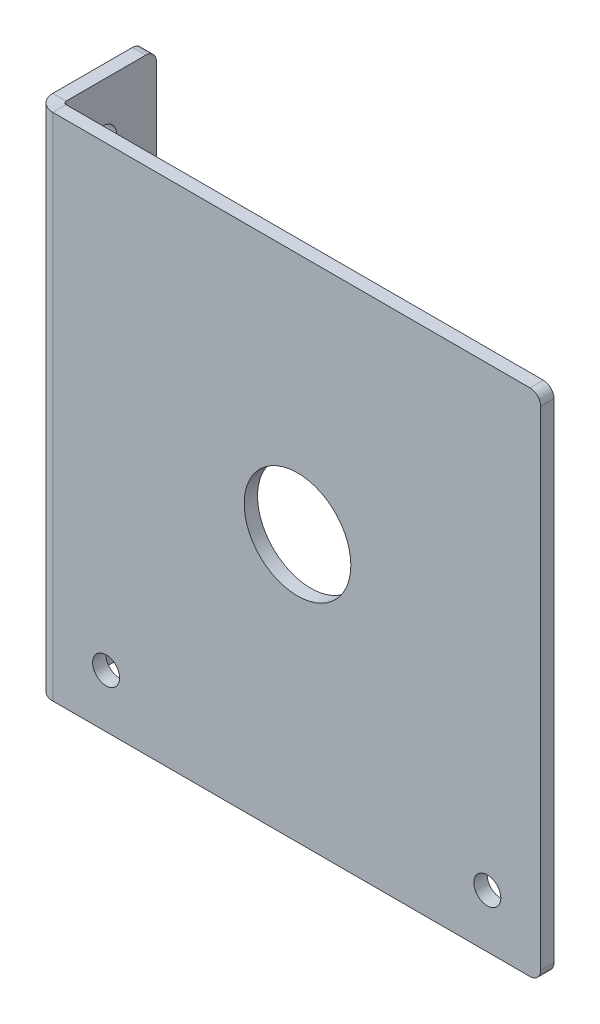
ISO-10303-21;
HEADER;
FILE_DESCRIPTION(('STEP AP214'),'2;1');
FILE_NAME('part.step','',(''),(''),'','','');
FILE_SCHEMA(('AUTOMOTIVE_DESIGN { 1 0 10303 214 1 1 1 1 }'));
ENDSEC;
DATA;
#1=APPLICATION_CONTEXT('core data for automotive mechanical design processes');
#2=APPLICATION_PROTOCOL_DEFINITION('international standard','automotive_design',2000,#1);
#3=PRODUCT_CONTEXT('',#1,'mechanical');
#4=PRODUCT('Part','Part','',(#3));
#5=PRODUCT_RELATED_PRODUCT_CATEGORY('part','',(#4));
#6=PRODUCT_DEFINITION_FORMATION('','',#4);
#7=PRODUCT_DEFINITION_CONTEXT('part definition',#1,'design');
#8=PRODUCT_DEFINITION('design','',#6,#7);
#9=PRODUCT_DEFINITION_SHAPE('','',#8);
#10=(LENGTH_UNIT() NAMED_UNIT(*) SI_UNIT(.MILLI.,.METRE.));
#11=(NAMED_UNIT(*) PLANE_ANGLE_UNIT() SI_UNIT($,.RADIAN.));
#12=(NAMED_UNIT(*) SI_UNIT($,.STERADIAN.) SOLID_ANGLE_UNIT());
#13=UNCERTAINTY_MEASURE_WITH_UNIT(LENGTH_MEASURE(1.E-05),#10,'distance_accuracy_value','');
#14=(GEOMETRIC_REPRESENTATION_CONTEXT(3) GLOBAL_UNCERTAINTY_ASSIGNED_CONTEXT((#13)) GLOBAL_UNIT_ASSIGNED_CONTEXT((#10,
#11,#12)) REPRESENTATION_CONTEXT('',''));
#15=CARTESIAN_POINT('',(0.,0.,0.));
#16=DIRECTION('',(0.,0.,1.));
#17=DIRECTION('',(1.,0.,0.));
#18=AXIS2_PLACEMENT_3D('',#15,#16,#17);
#19=CARTESIAN_POINT('',(0.,0.,3.175));
#20=DIRECTION('',(0.,0.,1.));
#21=DIRECTION('',(1.,0.,0.));
#22=AXIS2_PLACEMENT_3D('',#19,#20,#21);
#23=PLANE('',#22);
#24=CARTESIAN_POINT('',(-45.576335057773,-50.8,3.175));
#25=DIRECTION('',(0.,0.,-1.));
#26=DIRECTION('',(-1.,0.,0.));
#27=AXIS2_PLACEMENT_3D('',#24,#25,#26);
#28=CIRCLE('',#27,3.20625370577771);
#29=CARTESIAN_POINT('',(-48.7825887635507,-50.8,3.175));
#30=VERTEX_POINT('',#29);
#31=EDGE_CURVE('E315',#30,#30,#28,.T.);
#32=ORIENTED_EDGE('',*,*,#31,.T.);
#33=EDGE_LOOP('',(#32));
#34=FACE_BOUND('',#33,.T.);
#35=CARTESIAN_POINT('',(45.2,-50.8,3.175));
#36=DIRECTION('',(0.,0.,-1.));
#37=DIRECTION('',(-1.,0.,0.));
#38=AXIS2_PLACEMENT_3D('',#35,#36,#37);
#39=CIRCLE('',#38,3.20625370577771);
#40=CARTESIAN_POINT('',(41.9937462942223,-50.8,3.175));
#41=VERTEX_POINT('',#40);
#42=EDGE_CURVE('E323',#41,#41,#39,.T.);
#43=ORIENTED_EDGE('',*,*,#42,.T.);
#44=EDGE_LOOP('',(#43));
#45=FACE_BOUND('',#44,.T.);
#46=CARTESIAN_POINT('',(0.,0.,3.175));
#47=DIRECTION('',(0.,0.,1.));
#48=DIRECTION('',(1.,0.,0.));
#49=AXIS2_PLACEMENT_3D('',#46,#47,#48);
#50=CIRCLE('',#49,12.7);
#51=CARTESIAN_POINT('',(12.7,0.,3.175));
#52=VERTEX_POINT('',#51);
#53=EDGE_CURVE('E226',#52,#52,#50,.T.);
#54=ORIENTED_EDGE('',*,*,#53,.F.);
#55=EDGE_LOOP('',(#54));
#56=FACE_BOUND('',#55,.T.);
#57=DIRECTION('',(1.,0.,0.));
#58=VECTOR('',#57,1.);
#59=CARTESIAN_POINT('',(-62.187935057773,-63.5,3.175));
#60=LINE('',#59,#58);
#61=CARTESIAN_POINT('',(-58.276335057773,-63.5,3.175));
#62=VERTEX_POINT('',#61);
#63=CARTESIAN_POINT('',(55.36,-63.5,3.175));
#64=VERTEX_POINT('',#63);
#65=EDGE_CURVE('E234',#62,#64,#60,.T.);
#66=ORIENTED_EDGE('',*,*,#65,.T.);
#67=CARTESIAN_POINT('',(55.36,-60.96,3.175));
#68=DIRECTION('',(0.,0.,1.));
#69=DIRECTION('',(1.,0.,0.));
#70=AXIS2_PLACEMENT_3D('',#67,#68,#69);
#71=CIRCLE('',#70,2.54);
#72=CARTESIAN_POINT('',(57.9,-60.96,3.175));
#73=VERTEX_POINT('',#72);
#74=EDGE_CURVE('E73',#64,#73,#71,.T.);
#75=ORIENTED_EDGE('',*,*,#74,.T.);
#76=DIRECTION('',(0.,1.,0.));
#77=VECTOR('',#76,1.);
#78=CARTESIAN_POINT('',(57.9,-63.5,3.175));
#79=LINE('',#78,#77);
#80=CARTESIAN_POINT('',(57.9,55.36,3.175));
#81=VERTEX_POINT('',#80);
#82=EDGE_CURVE('E237',#73,#81,#79,.T.);
#83=ORIENTED_EDGE('',*,*,#82,.T.);
#84=CARTESIAN_POINT('',(55.36,55.36,3.175));
#85=DIRECTION('',(0.,0.,1.));
#86=DIRECTION('',(1.,0.,0.));
#87=AXIS2_PLACEMENT_3D('',#84,#85,#86);
#88=CIRCLE('',#87,2.54);
#89=CARTESIAN_POINT('',(55.36,57.9,3.175));
#90=VERTEX_POINT('',#89);
#91=EDGE_CURVE('E80',#81,#90,#88,.T.);
#92=ORIENTED_EDGE('',*,*,#91,.T.);
#93=DIRECTION('',(-1.,0.,0.));
#94=VECTOR('',#93,1.);
#95=CARTESIAN_POINT('',(-62.187935057773,57.9,3.175));
#96=LINE('',#95,#94);
#97=CARTESIAN_POINT('',(-58.276335057773,57.9,3.175));
#98=VERTEX_POINT('',#97);
#99=EDGE_CURVE('E232',#90,#98,#96,.T.);
#100=ORIENTED_EDGE('',*,*,#99,.T.);
#101=DIRECTION('',(0.,1.,0.));
#102=VECTOR('',#101,1.);
#103=CARTESIAN_POINT('',(-58.276335057773,57.9,3.175));
#104=LINE('',#103,#102);
#105=EDGE_CURVE('E165',#98,#62,#104,.F.);
#106=ORIENTED_EDGE('',*,*,#105,.T.);
#107=EDGE_LOOP('',(#66,#75,#83,#92,#100,#106));
#108=FACE_BOUND('',#107,.T.);
#109=ADVANCED_FACE('F65',(#34,#45,#56,#108),#23,.T.);
#110=CARTESIAN_POINT('',(0.,0.,0.));
#111=DIRECTION('',(0.,0.,1.));
#112=DIRECTION('',(1.,0.,0.));
#113=AXIS2_PLACEMENT_3D('',#110,#111,#112);
#114=PLANE('',#113);
#115=CARTESIAN_POINT('',(-45.576335057773,-50.8,0.));
#116=DIRECTION('',(0.,0.,-1.));
#117=DIRECTION('',(-1.,0.,0.));
#118=AXIS2_PLACEMENT_3D('',#115,#116,#117);
#119=CIRCLE('',#118,3.20625370577771);
#120=CARTESIAN_POINT('',(-48.7825887635507,-50.8,0.));
#121=VERTEX_POINT('',#120);
#122=EDGE_CURVE('E329',#121,#121,#119,.T.);
#123=ORIENTED_EDGE('',*,*,#122,.F.);
#124=EDGE_LOOP('',(#123));
#125=FACE_BOUND('',#124,.T.);
#126=CARTESIAN_POINT('',(45.2,-50.8,0.));
#127=DIRECTION('',(0.,0.,-1.));
#128=DIRECTION('',(-1.,0.,0.));
#129=AXIS2_PLACEMENT_3D('',#126,#127,#128);
#130=CIRCLE('',#129,3.20625370577771);
#131=CARTESIAN_POINT('',(41.9937462942223,-50.8,0.));
#132=VERTEX_POINT('',#131);
#133=EDGE_CURVE('E326',#132,#132,#130,.T.);
#134=ORIENTED_EDGE('',*,*,#133,.F.);
#135=EDGE_LOOP('',(#134));
#136=FACE_BOUND('',#135,.T.);
#137=CARTESIAN_POINT('',(0.,0.,0.));
#138=DIRECTION('',(0.,0.,1.));
#139=DIRECTION('',(1.,0.,0.));
#140=AXIS2_PLACEMENT_3D('',#137,#138,#139);
#141=CIRCLE('',#140,12.7);
#142=CARTESIAN_POINT('',(12.7,0.,0.));
#143=VERTEX_POINT('',#142);
#144=EDGE_CURVE('E224',#143,#143,#141,.T.);
#145=ORIENTED_EDGE('',*,*,#144,.T.);
#146=EDGE_LOOP('',(#145));
#147=FACE_BOUND('',#146,.T.);
#148=DIRECTION('',(0.,1.,0.));
#149=VECTOR('',#148,1.);
#150=CARTESIAN_POINT('',(57.9,-63.5,0.));
#151=LINE('',#150,#149);
#152=CARTESIAN_POINT('',(57.9,-60.96,0.));
#153=VERTEX_POINT('',#152);
#154=CARTESIAN_POINT('',(57.9,55.36,0.));
#155=VERTEX_POINT('',#154);
#156=EDGE_CURVE('E235',#153,#155,#151,.T.);
#157=ORIENTED_EDGE('',*,*,#156,.F.);
#158=CARTESIAN_POINT('',(55.36,-60.96,0.));
#159=DIRECTION('',(0.,0.,1.));
#160=DIRECTION('',(1.,0.,0.));
#161=AXIS2_PLACEMENT_3D('',#158,#159,#160);
#162=CIRCLE('',#161,2.54);
#163=CARTESIAN_POINT('',(55.36,-63.5,0.));
#164=VERTEX_POINT('',#163);
#165=EDGE_CURVE('E268',#153,#164,#162,.F.);
#166=ORIENTED_EDGE('',*,*,#165,.T.);
#167=DIRECTION('',(1.,0.,0.));
#168=VECTOR('',#167,1.);
#169=CARTESIAN_POINT('',(-62.187935057773,-63.5,0.));
#170=LINE('',#169,#168);
#171=CARTESIAN_POINT('',(-58.276335057773,-63.5,0.));
#172=VERTEX_POINT('',#171);
#173=EDGE_CURVE('E241',#172,#164,#170,.T.);
#174=ORIENTED_EDGE('',*,*,#173,.F.);
#175=DIRECTION('',(0.,1.,0.));
#176=VECTOR('',#175,1.);
#177=CARTESIAN_POINT('',(-58.276335057773,57.9,0.));
#178=LINE('',#177,#176);
#179=CARTESIAN_POINT('',(-58.276335057773,57.9,0.));
#180=VERTEX_POINT('',#179);
#181=EDGE_CURVE('E218',#180,#172,#178,.F.);
#182=ORIENTED_EDGE('',*,*,#181,.F.);
#183=DIRECTION('',(-1.,0.,0.));
#184=VECTOR('',#183,1.);
#185=CARTESIAN_POINT('',(-62.187935057773,57.9,0.));
#186=LINE('',#185,#184);
#187=CARTESIAN_POINT('',(55.36,57.9,0.));
#188=VERTEX_POINT('',#187);
#189=EDGE_CURVE('E229',#188,#180,#186,.T.);
#190=ORIENTED_EDGE('',*,*,#189,.F.);
#191=CARTESIAN_POINT('',(55.36,55.36,0.));
#192=DIRECTION('',(0.,0.,1.));
#193=DIRECTION('',(1.,0.,0.));
#194=AXIS2_PLACEMENT_3D('',#191,#192,#193);
#195=CIRCLE('',#194,2.54);
#196=EDGE_CURVE('E266',#188,#155,#195,.F.);
#197=ORIENTED_EDGE('',*,*,#196,.T.);
#198=EDGE_LOOP('',(#157,#166,#174,#182,#190,#197));
#199=FACE_BOUND('',#198,.T.);
#200=ADVANCED_FACE('F282',(#125,#136,#147,#199),#114,.F.);
#201=CARTESIAN_POINT('',(-62.187935057773,57.9,3.175));
#202=DIRECTION('',(0.,-1.,0.));
#203=DIRECTION('',(1.,0.,0.));
#204=AXIS2_PLACEMENT_3D('',#201,#202,#203);
#205=PLANE('',#204);
#206=ORIENTED_EDGE('',*,*,#99,.F.);
#207=DIRECTION('',(0.,0.,-1.));
#208=VECTOR('',#207,1.);
#209=CARTESIAN_POINT('',(55.36,57.9,3.175));
#210=LINE('',#209,#208);
#211=EDGE_CURVE('E13',#90,#188,#210,.T.);
#212=ORIENTED_EDGE('',*,*,#211,.T.);
#213=ORIENTED_EDGE('',*,*,#189,.T.);
#214=DIRECTION('',(0.,0.,1.));
#215=VECTOR('',#214,1.);
#216=CARTESIAN_POINT('',(-58.276335057773,57.9,0.));
#217=LINE('',#216,#215);
#218=EDGE_CURVE('E214',#180,#98,#217,.T.);
#219=ORIENTED_EDGE('',*,*,#218,.T.);
#220=EDGE_LOOP('',(#206,#212,#213,#219));
#221=FACE_BOUND('',#220,.T.);
#222=ADVANCED_FACE('F346',(#221),#205,.F.);
#223=CARTESIAN_POINT('',(-62.187935057773,-63.5,3.175));
#224=DIRECTION('',(0.,1.,0.));
#225=DIRECTION('',(0.,0.,1.));
#226=AXIS2_PLACEMENT_3D('',#223,#224,#225);
#227=PLANE('',#226);
#228=ORIENTED_EDGE('',*,*,#173,.T.);
#229=DIRECTION('',(0.,0.,-1.));
#230=VECTOR('',#229,1.);
#231=CARTESIAN_POINT('',(55.36,-63.5,3.175));
#232=LINE('',#231,#230);
#233=EDGE_CURVE('E88',#164,#64,#232,.F.);
#234=ORIENTED_EDGE('',*,*,#233,.T.);
#235=ORIENTED_EDGE('',*,*,#65,.F.);
#236=DIRECTION('',(0.,0.,1.));
#237=VECTOR('',#236,1.);
#238=CARTESIAN_POINT('',(-58.276335057773,-63.5,0.));
#239=LINE('',#238,#237);
#240=EDGE_CURVE('E221',#172,#62,#239,.T.);
#241=ORIENTED_EDGE('',*,*,#240,.F.);
#242=EDGE_LOOP('',(#228,#234,#235,#241));
#243=FACE_BOUND('',#242,.T.);
#244=ADVANCED_FACE('F285',(#243),#227,.F.);
#245=CARTESIAN_POINT('',(57.9,-63.5,3.175));
#246=DIRECTION('',(-1.,0.,0.));
#247=DIRECTION('',(0.,-1.,0.));
#248=AXIS2_PLACEMENT_3D('',#245,#246,#247);
#249=PLANE('',#248);
#250=ORIENTED_EDGE('',*,*,#82,.F.);
#251=DIRECTION('',(0.,0.,-1.));
#252=VECTOR('',#251,1.);
#253=CARTESIAN_POINT('',(57.9,-60.96,3.175));
#254=LINE('',#253,#252);
#255=EDGE_CURVE('E263',#73,#153,#254,.T.);
#256=ORIENTED_EDGE('',*,*,#255,.T.);
#257=ORIENTED_EDGE('',*,*,#156,.T.);
#258=DIRECTION('',(0.,0.,-1.));
#259=VECTOR('',#258,1.);
#260=CARTESIAN_POINT('',(57.9,55.36,3.175));
#261=LINE('',#260,#259);
#262=EDGE_CURVE('E261',#155,#81,#261,.F.);
#263=ORIENTED_EDGE('',*,*,#262,.T.);
#264=EDGE_LOOP('',(#250,#256,#257,#263));
#265=FACE_BOUND('',#264,.T.);
#266=ADVANCED_FACE('F276',(#265),#249,.F.);
#267=CARTESIAN_POINT('',(0.,0.,3.175));
#268=DIRECTION('',(0.,0.,-1.));
#269=DIRECTION('',(-1.,0.,0.));
#270=AXIS2_PLACEMENT_3D('',#267,#268,#269);
#271=CYLINDRICAL_SURFACE('',#270,12.7);
#272=ORIENTED_EDGE('',*,*,#53,.T.);
#273=EDGE_LOOP('',(#272));
#274=FACE_BOUND('',#273,.T.);
#275=ORIENTED_EDGE('',*,*,#144,.F.);
#276=EDGE_LOOP('',(#275));
#277=FACE_BOUND('',#276,.T.);
#278=ADVANCED_FACE('F352',(#274,#277),#271,.F.);
#279=CARTESIAN_POINT('',(-58.276335057773,-63.5,-0.736599999999999));
#280=DIRECTION('',(0.,-1.,0.));
#281=DIRECTION('',(0.,0.,-1.));
#282=AXIS2_PLACEMENT_3D('',#279,#280,#281);
#283=PLANE('',#282);
#284=DIRECTION('',(1.,0.,0.));
#285=VECTOR('',#284,1.);
#286=CARTESIAN_POINT('',(-62.187935057773,-63.5,-0.736599999999986));
#287=LINE('',#286,#285);
#288=CARTESIAN_POINT('',(-59.012935057773,-63.5,-0.736599999999997));
#289=VERTEX_POINT('',#288);
#290=CARTESIAN_POINT('',(-62.187935057773,-63.5,-0.736599999999986));
#291=VERTEX_POINT('',#290);
#292=EDGE_CURVE('E208',#289,#291,#287,.F.);
#293=ORIENTED_EDGE('',*,*,#292,.F.);
#294=CARTESIAN_POINT('',(-58.276335057773,-63.5,-0.736599999999999));
#295=DIRECTION('',(0.,1.,0.));
#296=DIRECTION('',(0.,0.,1.));
#297=AXIS2_PLACEMENT_3D('',#294,#295,#296);
#298=CIRCLE('',#297,0.736600000000004);
#299=EDGE_CURVE('E169',#172,#289,#298,.F.);
#300=ORIENTED_EDGE('',*,*,#299,.F.);
#301=ORIENTED_EDGE('',*,*,#240,.T.);
#302=CARTESIAN_POINT('',(-58.276335057773,-63.5,-0.736599999999999));
#303=DIRECTION('',(0.,1.,0.));
#304=DIRECTION('',(0.,0.,1.));
#305=AXIS2_PLACEMENT_3D('',#302,#303,#304);
#306=CIRCLE('',#305,3.9116);
#307=EDGE_CURVE('E213',#62,#291,#306,.F.);
#308=ORIENTED_EDGE('',*,*,#307,.T.);
#309=EDGE_LOOP('',(#293,#300,#301,#308));
#310=FACE_BOUND('',#309,.T.);
#311=ADVANCED_FACE('F289',(#310),#283,.T.);
#312=CARTESIAN_POINT('',(-58.276335057773,57.9,-0.736599999999999));
#313=DIRECTION('',(0.,-1.,0.));
#314=DIRECTION('',(0.,0.,-1.));
#315=AXIS2_PLACEMENT_3D('',#312,#313,#314);
#316=PLANE('',#315);
#317=CARTESIAN_POINT('',(-58.276335057773,57.9,-0.736599999999999));
#318=DIRECTION('',(0.,1.,0.));
#319=DIRECTION('',(0.,0.,1.));
#320=AXIS2_PLACEMENT_3D('',#317,#318,#319);
#321=CIRCLE('',#320,0.736600000000004);
#322=CARTESIAN_POINT('',(-59.012935057773,57.9,-0.736599999999997));
#323=VERTEX_POINT('',#322);
#324=EDGE_CURVE('E176',#323,#180,#321,.T.);
#325=ORIENTED_EDGE('',*,*,#324,.F.);
#326=DIRECTION('',(1.,0.,0.));
#327=VECTOR('',#326,1.);
#328=CARTESIAN_POINT('',(-59.012935057773,57.9,-0.736599999999997));
#329=LINE('',#328,#327);
#330=CARTESIAN_POINT('',(-62.187935057773,57.9,-0.736599999999986));
#331=VERTEX_POINT('',#330);
#332=EDGE_CURVE('E173',#323,#331,#329,.F.);
#333=ORIENTED_EDGE('',*,*,#332,.T.);
#334=CARTESIAN_POINT('',(-58.276335057773,57.9,-0.736599999999999));
#335=DIRECTION('',(0.,1.,0.));
#336=DIRECTION('',(0.,0.,1.));
#337=AXIS2_PLACEMENT_3D('',#334,#335,#336);
#338=CIRCLE('',#337,3.9116);
#339=EDGE_CURVE('E158',#331,#98,#338,.T.);
#340=ORIENTED_EDGE('',*,*,#339,.T.);
#341=ORIENTED_EDGE('',*,*,#218,.F.);
#342=EDGE_LOOP('',(#325,#333,#340,#341));
#343=FACE_BOUND('',#342,.T.);
#344=ADVANCED_FACE('F174',(#343),#316,.F.);
#345=CARTESIAN_POINT('',(-58.276335057773,57.9,-0.736599999999999));
#346=DIRECTION('',(0.,1.,0.));
#347=DIRECTION('',(-1.,0.,0.));
#348=AXIS2_PLACEMENT_3D('',#345,#346,#347);
#349=CYLINDRICAL_SURFACE('',#348,3.9116);
#350=ORIENTED_EDGE('',*,*,#105,.F.);
#351=ORIENTED_EDGE('',*,*,#339,.F.);
#352=DIRECTION('',(0.,1.,0.));
#353=VECTOR('',#352,1.);
#354=CARTESIAN_POINT('',(-62.187935057773,-63.5,-0.736599999999986));
#355=LINE('',#354,#353);
#356=EDGE_CURVE('E162',#331,#291,#355,.F.);
#357=ORIENTED_EDGE('',*,*,#356,.T.);
#358=ORIENTED_EDGE('',*,*,#307,.F.);
#359=EDGE_LOOP('',(#350,#351,#357,#358));
#360=FACE_BOUND('',#359,.T.);
#361=ADVANCED_FACE('F160',(#360),#349,.T.);
#362=CARTESIAN_POINT('',(-58.276335057773,57.9,-0.736599999999999));
#363=DIRECTION('',(0.,1.,0.));
#364=DIRECTION('',(-1.,0.,0.));
#365=AXIS2_PLACEMENT_3D('',#362,#363,#364);
#366=CYLINDRICAL_SURFACE('',#365,0.736600000000004);
#367=ORIENTED_EDGE('',*,*,#181,.T.);
#368=ORIENTED_EDGE('',*,*,#299,.T.);
#369=DIRECTION('',(0.,1.,0.));
#370=VECTOR('',#369,1.);
#371=CARTESIAN_POINT('',(-59.012935057773,-63.5,-0.736599999999997));
#372=LINE('',#371,#370);
#373=EDGE_CURVE('E181',#289,#323,#372,.T.);
#374=ORIENTED_EDGE('',*,*,#373,.T.);
#375=ORIENTED_EDGE('',*,*,#324,.T.);
#376=EDGE_LOOP('',(#367,#368,#374,#375));
#377=FACE_BOUND('',#376,.T.);
#378=ADVANCED_FACE('F292',(#377),#366,.F.);
#379=CARTESIAN_POINT('',(-62.1879350577731,57.9,-22.225));
#380=DIRECTION('',(0.,-1.,0.));
#381=DIRECTION('',(0.,0.,-1.));
#382=AXIS2_PLACEMENT_3D('',#379,#380,#381);
#383=PLANE('',#382);
#384=DIRECTION('',(0.,0.,1.));
#385=VECTOR('',#384,1.);
#386=CARTESIAN_POINT('',(-59.012935057773,57.9,-22.225));
#387=LINE('',#386,#385);
#388=CARTESIAN_POINT('',(-59.012935057773,57.9,-19.685));
#389=VERTEX_POINT('',#388);
#390=EDGE_CURVE('E191',#323,#389,#387,.F.);
#391=ORIENTED_EDGE('',*,*,#390,.T.);
#392=DIRECTION('',(1.,0.,0.));
#393=VECTOR('',#392,1.);
#394=CARTESIAN_POINT('',(-62.187935057773,57.9,-19.685));
#395=LINE('',#394,#393);
#396=CARTESIAN_POINT('',(-62.187935057773,57.9,-19.685));
#397=VERTEX_POINT('',#396);
#398=EDGE_CURVE('E195',#389,#397,#395,.F.);
#399=ORIENTED_EDGE('',*,*,#398,.T.);
#400=DIRECTION('',(0.,0.,-1.));
#401=VECTOR('',#400,1.);
#402=CARTESIAN_POINT('',(-62.187935057773,57.9,1.3427377869413E-13));
#403=LINE('',#402,#401);
#404=EDGE_CURVE('E187',#331,#397,#403,.T.);
#405=ORIENTED_EDGE('',*,*,#404,.F.);
#406=ORIENTED_EDGE('',*,*,#332,.F.);
#407=EDGE_LOOP('',(#391,#399,#405,#406));
#408=FACE_BOUND('',#407,.T.);
#409=ADVANCED_FACE('F193',(#408),#383,.F.);
#410=CARTESIAN_POINT('',(-62.187935057773,-63.5,0.));
#411=DIRECTION('',(0.,1.,0.));
#412=DIRECTION('',(0.,0.,1.));
#413=AXIS2_PLACEMENT_3D('',#410,#411,#412);
#414=PLANE('',#413);
#415=DIRECTION('',(0.,0.,1.));
#416=VECTOR('',#415,1.);
#417=CARTESIAN_POINT('',(-62.187935057773,-63.5,2.24658920884508E-13));
#418=LINE('',#417,#416);
#419=CARTESIAN_POINT('',(-62.187935057773,-63.5,-19.685));
#420=VERTEX_POINT('',#419);
#421=EDGE_CURVE('E190',#420,#291,#418,.T.);
#422=ORIENTED_EDGE('',*,*,#421,.F.);
#423=DIRECTION('',(1.,0.,0.));
#424=VECTOR('',#423,1.);
#425=CARTESIAN_POINT('',(-62.187935057773,-63.5,-19.685));
#426=LINE('',#425,#424);
#427=CARTESIAN_POINT('',(-59.012935057773,-63.5,-19.685));
#428=VERTEX_POINT('',#427);
#429=EDGE_CURVE('E239',#420,#428,#426,.T.);
#430=ORIENTED_EDGE('',*,*,#429,.T.);
#431=DIRECTION('',(0.,0.,-1.));
#432=VECTOR('',#431,1.);
#433=CARTESIAN_POINT('',(-59.012935057773,-63.5,0.));
#434=LINE('',#433,#432);
#435=EDGE_CURVE('E197',#428,#289,#434,.F.);
#436=ORIENTED_EDGE('',*,*,#435,.T.);
#437=ORIENTED_EDGE('',*,*,#292,.T.);
#438=EDGE_LOOP('',(#422,#430,#436,#437));
#439=FACE_BOUND('',#438,.T.);
#440=ADVANCED_FACE('F309',(#439),#414,.F.);
#441=CARTESIAN_POINT('',(-62.187935057773,0.,2.24658920884508E-13));
#442=DIRECTION('',(1.,0.,0.));
#443=DIRECTION('',(0.,0.,-1.));
#444=AXIS2_PLACEMENT_3D('',#441,#442,#443);
#445=PLANE('',#444);
#446=CARTESIAN_POINT('',(-62.1879350577731,45.2,-9.525));
#447=DIRECTION('',(1.,0.,0.));
#448=DIRECTION('',(0.,0.,-1.));
#449=AXIS2_PLACEMENT_3D('',#446,#447,#448);
#450=CIRCLE('',#449,3.205);
#451=CARTESIAN_POINT('',(-62.1879350577731,45.2,-12.73));
#452=VERTEX_POINT('',#451);
#453=EDGE_CURVE('E211',#452,#452,#450,.T.);
#454=ORIENTED_EDGE('',*,*,#453,.T.);
#455=EDGE_LOOP('',(#454));
#456=FACE_BOUND('',#455,.T.);
#457=CARTESIAN_POINT('',(-62.1879350577731,-25.4,-9.525));
#458=DIRECTION('',(1.,0.,0.));
#459=DIRECTION('',(0.,0.,-1.));
#460=AXIS2_PLACEMENT_3D('',#457,#458,#459);
#461=CIRCLE('',#460,3.205);
#462=CARTESIAN_POINT('',(-62.1879350577731,-25.4,-12.73));
#463=VERTEX_POINT('',#462);
#464=EDGE_CURVE('E311',#463,#463,#461,.T.);
#465=ORIENTED_EDGE('',*,*,#464,.T.);
#466=EDGE_LOOP('',(#465));
#467=FACE_BOUND('',#466,.T.);
#468=DIRECTION('',(0.,-1.,0.));
#469=VECTOR('',#468,1.);
#470=CARTESIAN_POINT('',(-62.187935057773,0.,-22.225));
#471=LINE('',#470,#469);
#472=CARTESIAN_POINT('',(-62.187935057773,55.36,-22.225));
#473=VERTEX_POINT('',#472);
#474=CARTESIAN_POINT('',(-62.187935057773,-60.96,-22.225));
#475=VERTEX_POINT('',#474);
#476=EDGE_CURVE('E196',#473,#475,#471,.T.);
#477=ORIENTED_EDGE('',*,*,#476,.T.);
#478=CARTESIAN_POINT('',(-62.187935057773,-60.96,-19.685));
#479=DIRECTION('',(1.,0.,0.));
#480=DIRECTION('',(0.,0.,-1.));
#481=AXIS2_PLACEMENT_3D('',#478,#479,#480);
#482=CIRCLE('',#481,2.54);
#483=EDGE_CURVE('E258',#475,#420,#482,.F.);
#484=ORIENTED_EDGE('',*,*,#483,.T.);
#485=ORIENTED_EDGE('',*,*,#421,.T.);
#486=ORIENTED_EDGE('',*,*,#356,.F.);
#487=ORIENTED_EDGE('',*,*,#404,.T.);
#488=CARTESIAN_POINT('',(-62.187935057773,55.36,-19.685));
#489=DIRECTION('',(1.,0.,0.));
#490=DIRECTION('',(0.,0.,-1.));
#491=AXIS2_PLACEMENT_3D('',#488,#489,#490);
#492=CIRCLE('',#491,2.54);
#493=EDGE_CURVE('E256',#397,#473,#492,.F.);
#494=ORIENTED_EDGE('',*,*,#493,.T.);
#495=EDGE_LOOP('',(#477,#484,#485,#486,#487,#494));
#496=FACE_BOUND('',#495,.T.);
#497=ADVANCED_FACE('F186',(#456,#467,#496),#445,.F.);
#498=CARTESIAN_POINT('',(-59.012935057773,0.,2.13573467633681E-13));
#499=DIRECTION('',(1.,0.,0.));
#500=DIRECTION('',(0.,0.,-1.));
#501=AXIS2_PLACEMENT_3D('',#498,#499,#500);
#502=PLANE('',#501);
#503=CARTESIAN_POINT('',(-59.012935057773,45.2,-9.52500000000001));
#504=DIRECTION('',(1.,0.,0.));
#505=DIRECTION('',(0.,0.,-1.));
#506=AXIS2_PLACEMENT_3D('',#503,#504,#505);
#507=CIRCLE('',#506,3.205);
#508=CARTESIAN_POINT('',(-59.012935057773,45.2,-12.73));
#509=VERTEX_POINT('',#508);
#510=EDGE_CURVE('E318',#509,#509,#507,.T.);
#511=ORIENTED_EDGE('',*,*,#510,.F.);
#512=EDGE_LOOP('',(#511));
#513=FACE_BOUND('',#512,.T.);
#514=CARTESIAN_POINT('',(-59.012935057773,-25.4,-9.52500000000001));
#515=DIRECTION('',(1.,0.,0.));
#516=DIRECTION('',(0.,0.,-1.));
#517=AXIS2_PLACEMENT_3D('',#514,#515,#516);
#518=CIRCLE('',#517,3.205);
#519=CARTESIAN_POINT('',(-59.012935057773,-25.4,-12.73));
#520=VERTEX_POINT('',#519);
#521=EDGE_CURVE('E314',#520,#520,#518,.T.);
#522=ORIENTED_EDGE('',*,*,#521,.F.);
#523=EDGE_LOOP('',(#522));
#524=FACE_BOUND('',#523,.T.);
#525=ORIENTED_EDGE('',*,*,#435,.F.);
#526=CARTESIAN_POINT('',(-59.012935057773,-60.96,-19.685));
#527=DIRECTION('',(1.,0.,0.));
#528=DIRECTION('',(0.,0.,-1.));
#529=AXIS2_PLACEMENT_3D('',#526,#527,#528);
#530=CIRCLE('',#529,2.54);
#531=CARTESIAN_POINT('',(-59.012935057773,-60.96,-22.225));
#532=VERTEX_POINT('',#531);
#533=EDGE_CURVE('E249',#428,#532,#530,.T.);
#534=ORIENTED_EDGE('',*,*,#533,.T.);
#535=DIRECTION('',(0.,1.,0.));
#536=VECTOR('',#535,1.);
#537=CARTESIAN_POINT('',(-59.012935057773,-63.5,-22.225));
#538=LINE('',#537,#536);
#539=CARTESIAN_POINT('',(-59.012935057773,55.36,-22.225));
#540=VERTEX_POINT('',#539);
#541=EDGE_CURVE('E200',#540,#532,#538,.F.);
#542=ORIENTED_EDGE('',*,*,#541,.F.);
#543=CARTESIAN_POINT('',(-59.012935057773,55.36,-19.685));
#544=DIRECTION('',(1.,0.,0.));
#545=DIRECTION('',(0.,0.,-1.));
#546=AXIS2_PLACEMENT_3D('',#543,#544,#545);
#547=CIRCLE('',#546,2.54);
#548=EDGE_CURVE('E247',#540,#389,#547,.T.);
#549=ORIENTED_EDGE('',*,*,#548,.T.);
#550=ORIENTED_EDGE('',*,*,#390,.F.);
#551=ORIENTED_EDGE('',*,*,#373,.F.);
#552=EDGE_LOOP('',(#525,#534,#542,#549,#550,#551));
#553=FACE_BOUND('',#552,.T.);
#554=ADVANCED_FACE('F295',(#513,#524,#553),#502,.T.);
#555=CARTESIAN_POINT('',(-62.1879350577731,-63.5,-22.225));
#556=DIRECTION('',(0.,0.,1.));
#557=DIRECTION('',(1.,0.,0.));
#558=AXIS2_PLACEMENT_3D('',#555,#556,#557);
#559=PLANE('',#558);
#560=ORIENTED_EDGE('',*,*,#541,.T.);
#561=DIRECTION('',(1.,0.,0.));
#562=VECTOR('',#561,1.);
#563=CARTESIAN_POINT('',(-62.1879350577731,-60.96,-22.225));
#564=LINE('',#563,#562);
#565=EDGE_CURVE('E254',#532,#475,#564,.F.);
#566=ORIENTED_EDGE('',*,*,#565,.T.);
#567=ORIENTED_EDGE('',*,*,#476,.F.);
#568=DIRECTION('',(1.,0.,0.));
#569=VECTOR('',#568,1.);
#570=CARTESIAN_POINT('',(-62.1879350577731,55.36,-22.225));
#571=LINE('',#570,#569);
#572=EDGE_CURVE('E251',#473,#540,#571,.T.);
#573=ORIENTED_EDGE('',*,*,#572,.T.);
#574=EDGE_LOOP('',(#560,#566,#567,#573));
#575=FACE_BOUND('',#574,.T.);
#576=ADVANCED_FACE('F303',(#575),#559,.F.);
#577=CARTESIAN_POINT('',(-62.187935057773,-60.96,-19.685));
#578=DIRECTION('',(1.,0.,0.));
#579=DIRECTION('',(0.,0.,-1.));
#580=AXIS2_PLACEMENT_3D('',#577,#578,#579);
#581=CYLINDRICAL_SURFACE('',#580,2.54);
#582=ORIENTED_EDGE('',*,*,#483,.F.);
#583=ORIENTED_EDGE('',*,*,#565,.F.);
#584=ORIENTED_EDGE('',*,*,#533,.F.);
#585=ORIENTED_EDGE('',*,*,#429,.F.);
#586=EDGE_LOOP('',(#582,#583,#584,#585));
#587=FACE_BOUND('',#586,.T.);
#588=ADVANCED_FACE('F306',(#587),#581,.T.);
#589=CARTESIAN_POINT('',(-62.187935057773,55.36,-19.685));
#590=DIRECTION('',(1.,0.,0.));
#591=DIRECTION('',(0.,0.,-1.));
#592=AXIS2_PLACEMENT_3D('',#589,#590,#591);
#593=CYLINDRICAL_SURFACE('',#592,2.54);
#594=ORIENTED_EDGE('',*,*,#493,.F.);
#595=ORIENTED_EDGE('',*,*,#398,.F.);
#596=ORIENTED_EDGE('',*,*,#548,.F.);
#597=ORIENTED_EDGE('',*,*,#572,.F.);
#598=EDGE_LOOP('',(#594,#595,#596,#597));
#599=FACE_BOUND('',#598,.T.);
#600=ADVANCED_FACE('F298',(#599),#593,.T.);
#601=CARTESIAN_POINT('',(55.36,-60.96,3.175));
#602=DIRECTION('',(0.,0.,-1.));
#603=DIRECTION('',(-1.,0.,0.));
#604=AXIS2_PLACEMENT_3D('',#601,#602,#603);
#605=CYLINDRICAL_SURFACE('',#604,2.54);
#606=ORIENTED_EDGE('',*,*,#74,.F.);
#607=ORIENTED_EDGE('',*,*,#233,.F.);
#608=ORIENTED_EDGE('',*,*,#165,.F.);
#609=ORIENTED_EDGE('',*,*,#255,.F.);
#610=EDGE_LOOP('',(#606,#607,#608,#609));
#611=FACE_BOUND('',#610,.T.);
#612=ADVANCED_FACE('F279',(#611),#605,.T.);
#613=CARTESIAN_POINT('',(55.36,55.36,3.175));
#614=DIRECTION('',(0.,0.,-1.));
#615=DIRECTION('',(-1.,0.,0.));
#616=AXIS2_PLACEMENT_3D('',#613,#614,#615);
#617=CYLINDRICAL_SURFACE('',#616,2.54);
#618=ORIENTED_EDGE('',*,*,#91,.F.);
#619=ORIENTED_EDGE('',*,*,#262,.F.);
#620=ORIENTED_EDGE('',*,*,#196,.F.);
#621=ORIENTED_EDGE('',*,*,#211,.F.);
#622=EDGE_LOOP('',(#618,#619,#620,#621));
#623=FACE_BOUND('',#622,.T.);
#624=ADVANCED_FACE('F67',(#623),#617,.T.);
#625=CARTESIAN_POINT('',(-62.1879350577731,-25.4,-9.525));
#626=DIRECTION('',(1.,0.,0.));
#627=DIRECTION('',(0.,0.,-1.));
#628=AXIS2_PLACEMENT_3D('',#625,#626,#627);
#629=CYLINDRICAL_SURFACE('',#628,3.205);
#630=ORIENTED_EDGE('',*,*,#464,.F.);
#631=EDGE_LOOP('',(#630));
#632=FACE_BOUND('',#631,.T.);
#633=ORIENTED_EDGE('',*,*,#521,.T.);
#634=EDGE_LOOP('',(#633));
#635=FACE_BOUND('',#634,.T.);
#636=ADVANCED_FACE('F381',(#632,#635),#629,.F.);
#637=CARTESIAN_POINT('',(-62.1879350577731,45.2,-9.525));
#638=DIRECTION('',(1.,0.,0.));
#639=DIRECTION('',(0.,0.,-1.));
#640=AXIS2_PLACEMENT_3D('',#637,#638,#639);
#641=CYLINDRICAL_SURFACE('',#640,3.205);
#642=ORIENTED_EDGE('',*,*,#453,.F.);
#643=EDGE_LOOP('',(#642));
#644=FACE_BOUND('',#643,.T.);
#645=ORIENTED_EDGE('',*,*,#510,.T.);
#646=EDGE_LOOP('',(#645));
#647=FACE_BOUND('',#646,.T.);
#648=ADVANCED_FACE('F387',(#644,#647),#641,.F.);
#649=CARTESIAN_POINT('',(45.2,-50.8,3.175));
#650=DIRECTION('',(0.,0.,-1.));
#651=DIRECTION('',(-1.,0.,0.));
#652=AXIS2_PLACEMENT_3D('',#649,#650,#651);
#653=CYLINDRICAL_SURFACE('',#652,3.20625370577771);
#654=CARTESIAN_POINT('',(41.9937462942223,-50.8,3.175));
#655=CARTESIAN_POINT('',(41.9937462942223,-50.8,3.14192708333334));
#656=CARTESIAN_POINT('',(41.9937462942223,-50.8,3.10885416666667));
#657=CARTESIAN_POINT('',(41.9937462942223,-50.8,3.04270833333334));
#658=CARTESIAN_POINT('',(41.9937462942223,-50.8,3.00963541666667));
#659=CARTESIAN_POINT('',(41.9937462942223,-50.8,2.94348958333334));
#660=CARTESIAN_POINT('',(41.9937462942223,-50.8,2.91041666666667));
#661=CARTESIAN_POINT('',(41.9937462942223,-50.8,2.84427083333334));
#662=CARTESIAN_POINT('',(41.9937462942223,-50.8,2.81119791666667));
#663=CARTESIAN_POINT('',(41.9937462942223,-50.8,2.74505208333334));
#664=CARTESIAN_POINT('',(41.9937462942223,-50.8,2.71197916666667));
#665=CARTESIAN_POINT('',(41.9937462942223,-50.8,2.64583333333334));
#666=CARTESIAN_POINT('',(41.9937462942223,-50.8,2.61276041666667));
#667=CARTESIAN_POINT('',(41.9937462942223,-50.8,2.54661458333334));
#668=CARTESIAN_POINT('',(41.9937462942223,-50.8,2.51354166666667));
#669=CARTESIAN_POINT('',(41.9937462942223,-50.8,2.44739583333334));
#670=CARTESIAN_POINT('',(41.9937462942223,-50.8,2.41432291666667));
#671=CARTESIAN_POINT('',(41.9937462942223,-50.8,2.34817708333334));
#672=CARTESIAN_POINT('',(41.9937462942223,-50.8,2.31510416666667));
#673=CARTESIAN_POINT('',(41.9937462942223,-50.8,2.24895833333334));
#674=CARTESIAN_POINT('',(41.9937462942223,-50.8,2.21588541666667));
#675=CARTESIAN_POINT('',(41.9937462942223,-50.8,2.14973958333334));
#676=CARTESIAN_POINT('',(41.9937462942223,-50.8,2.11666666666667));
#677=CARTESIAN_POINT('',(41.9937462942223,-50.8,2.05052083333334));
#678=CARTESIAN_POINT('',(41.9937462942223,-50.8,2.01744791666667));
#679=CARTESIAN_POINT('',(41.9937462942223,-50.8,1.95130208333334));
#680=CARTESIAN_POINT('',(41.9937462942223,-50.8,1.91822916666667));
#681=CARTESIAN_POINT('',(41.9937462942223,-50.8,1.85208333333334));
#682=CARTESIAN_POINT('',(41.9937462942223,-50.8,1.81901041666667));
#683=CARTESIAN_POINT('',(41.9937462942223,-50.8,1.75286458333334));
#684=CARTESIAN_POINT('',(41.9937462942223,-50.8,1.71979166666667));
#685=CARTESIAN_POINT('',(41.9937462942223,-50.8,1.65364583333334));
#686=CARTESIAN_POINT('',(41.9937462942223,-50.8,1.62057291666667));
#687=CARTESIAN_POINT('',(41.9937462942223,-50.8,1.55442708333334));
#688=CARTESIAN_POINT('',(41.9937462942223,-50.8,1.52135416666667));
#689=CARTESIAN_POINT('',(41.9937462942223,-50.8,1.45520833333334));
#690=CARTESIAN_POINT('',(41.9937462942223,-50.8,1.42213541666667));
#691=CARTESIAN_POINT('',(41.9937462942223,-50.8,1.35598958333334));
#692=CARTESIAN_POINT('',(41.9937462942223,-50.8,1.32291666666667));
#693=CARTESIAN_POINT('',(41.9937462942223,-50.8,1.25677083333334));
#694=CARTESIAN_POINT('',(41.9937462942223,-50.8,1.22369791666667));
#695=CARTESIAN_POINT('',(41.9937462942223,-50.8,1.15755208333334));
#696=CARTESIAN_POINT('',(41.9937462942223,-50.8,1.12447916666667));
#697=CARTESIAN_POINT('',(41.9937462942223,-50.8,1.05833333333334));
#698=CARTESIAN_POINT('',(41.9937462942223,-50.8,1.02526041666667));
#699=CARTESIAN_POINT('',(41.9937462942223,-50.8,0.959114583333335));
#700=CARTESIAN_POINT('',(41.9937462942223,-50.8,0.926041666666668));
#701=CARTESIAN_POINT('',(41.9937462942223,-50.8,0.859895833333335));
#702=CARTESIAN_POINT('',(41.9937462942223,-50.8,0.826822916666668));
#703=CARTESIAN_POINT('',(41.9937462942223,-50.8,0.760677083333335));
#704=CARTESIAN_POINT('',(41.9937462942223,-50.8,0.727604166666668));
#705=CARTESIAN_POINT('',(41.9937462942223,-50.8,0.661458333333335));
#706=CARTESIAN_POINT('',(41.9937462942223,-50.8,0.628385416666668));
#707=CARTESIAN_POINT('',(41.9937462942223,-50.8,0.562239583333335));
#708=CARTESIAN_POINT('',(41.9937462942223,-50.8,0.529166666666668));
#709=CARTESIAN_POINT('',(41.9937462942223,-50.8,0.463020833333334));
#710=CARTESIAN_POINT('',(41.9937462942223,-50.8,0.429947916666668));
#711=CARTESIAN_POINT('',(41.9937462942223,-50.8,0.363802083333334));
#712=CARTESIAN_POINT('',(41.9937462942223,-50.8,0.330729166666668));
#713=CARTESIAN_POINT('',(41.9937462942223,-50.8,0.264583333333334));
#714=CARTESIAN_POINT('',(41.9937462942223,-50.8,0.231510416666667));
#715=CARTESIAN_POINT('',(41.9937462942223,-50.8,0.165364583333334));
#716=CARTESIAN_POINT('',(41.9937462942223,-50.8,0.132291666666667));
#717=CARTESIAN_POINT('',(41.9937462942223,-50.8,0.066145833333334));
#718=CARTESIAN_POINT('',(41.9937462942223,-50.8,0.0330729166666671));
#719=CARTESIAN_POINT('',(41.9937462942223,-50.8,0.));
#720=B_SPLINE_CURVE_WITH_KNOTS('',3,(#654,#655,#656,#657,#658,#659,#660,#661,#662,#663,#664,
#665,#666,#667,#668,#669,#670,#671,#672,#673,#674,#675,#676,#677,#678,#679,#680,#681,#682,#683,
#684,#685,#686,#687,#688,#689,#690,#691,#692,#693,#694,#695,#696,#697,#698,#699,#700,#701,#702,
#703,#704,#705,#706,#707,#708,#709,#710,#711,#712,#713,#714,#715,#716,#717,#718,#719),
.UNSPECIFIED.,.F.,.F.,(4,2,2,2,2,2,2,2,2,2,2,2,2,2,2,2,2,2,2,2,2,2,2,2,2,2,2,2,2,2,2,2,4),(0.,
0.0992187500000004,0.1984375,0.297656250000001,0.396875000000001,0.496093750000001,
0.595312500000001,0.694531250000001,0.793750000000002,0.892968750000001,0.992187500000001,
1.09140625,1.190625,1.28984375,1.3890625,1.48828125,1.5875,1.68671875,1.7859375,1.88515625,
1.984375,2.08359375,2.1828125,2.28203125,2.38125,2.48046875,2.5796875,2.67890625,2.778125,
2.87734375,2.9765625,3.07578125,3.175),.UNSPECIFIED.);
#721=EDGE_CURVE('BSEAM340',#41,#132,#720,.T.);
#722=ORIENTED_EDGE('',*,*,#42,.F.);
#723=ORIENTED_EDGE('',*,*,#133,.T.);
#724=ORIENTED_EDGE('',*,*,#721,.T.);
#725=ORIENTED_EDGE('',*,*,#721,.F.);
#726=EDGE_LOOP('',(#722,#724,#723,#725));
#727=FACE_BOUND('',#726,.T.);
#728=ADVANCED_FACE('F340',(#727),#653,.F.);
#729=CARTESIAN_POINT('',(-45.576335057773,-50.8,3.175));
#730=DIRECTION('',(0.,0.,-1.));
#731=DIRECTION('',(-1.,0.,0.));
#732=AXIS2_PLACEMENT_3D('',#729,#730,#731);
#733=CYLINDRICAL_SURFACE('',#732,3.20625370577771);
#734=CARTESIAN_POINT('',(-48.7825887635507,-50.8,3.175));
#735=CARTESIAN_POINT('',(-48.7825887635507,-50.8,3.14192708333334));
#736=CARTESIAN_POINT('',(-48.7825887635507,-50.8,3.10885416666667));
#737=CARTESIAN_POINT('',(-48.7825887635507,-50.8,3.04270833333334));
#738=CARTESIAN_POINT('',(-48.7825887635507,-50.8,3.00963541666667));
#739=CARTESIAN_POINT('',(-48.7825887635507,-50.8,2.94348958333334));
#740=CARTESIAN_POINT('',(-48.7825887635507,-50.8,2.91041666666667));
#741=CARTESIAN_POINT('',(-48.7825887635507,-50.8,2.84427083333334));
#742=CARTESIAN_POINT('',(-48.7825887635507,-50.8,2.81119791666667));
#743=CARTESIAN_POINT('',(-48.7825887635507,-50.8,2.74505208333334));
#744=CARTESIAN_POINT('',(-48.7825887635507,-50.8,2.71197916666667));
#745=CARTESIAN_POINT('',(-48.7825887635507,-50.8,2.64583333333334));
#746=CARTESIAN_POINT('',(-48.7825887635507,-50.8,2.61276041666667));
#747=CARTESIAN_POINT('',(-48.7825887635507,-50.8,2.54661458333334));
#748=CARTESIAN_POINT('',(-48.7825887635507,-50.8,2.51354166666667));
#749=CARTESIAN_POINT('',(-48.7825887635507,-50.8,2.44739583333334));
#750=CARTESIAN_POINT('',(-48.7825887635507,-50.8,2.41432291666667));
#751=CARTESIAN_POINT('',(-48.7825887635507,-50.8,2.34817708333334));
#752=CARTESIAN_POINT('',(-48.7825887635507,-50.8,2.31510416666667));
#753=CARTESIAN_POINT('',(-48.7825887635507,-50.8,2.24895833333334));
#754=CARTESIAN_POINT('',(-48.7825887635507,-50.8,2.21588541666667));
#755=CARTESIAN_POINT('',(-48.7825887635507,-50.8,2.14973958333334));
#756=CARTESIAN_POINT('',(-48.7825887635507,-50.8,2.11666666666667));
#757=CARTESIAN_POINT('',(-48.7825887635507,-50.8,2.05052083333334));
#758=CARTESIAN_POINT('',(-48.7825887635507,-50.8,2.01744791666667));
#759=CARTESIAN_POINT('',(-48.7825887635507,-50.8,1.95130208333334));
#760=CARTESIAN_POINT('',(-48.7825887635507,-50.8,1.91822916666667));
#761=CARTESIAN_POINT('',(-48.7825887635507,-50.8,1.85208333333334));
#762=CARTESIAN_POINT('',(-48.7825887635507,-50.8,1.81901041666667));
#763=CARTESIAN_POINT('',(-48.7825887635507,-50.8,1.75286458333334));
#764=CARTESIAN_POINT('',(-48.7825887635507,-50.8,1.71979166666667));
#765=CARTESIAN_POINT('',(-48.7825887635507,-50.8,1.65364583333334));
#766=CARTESIAN_POINT('',(-48.7825887635507,-50.8,1.62057291666667));
#767=CARTESIAN_POINT('',(-48.7825887635507,-50.8,1.55442708333334));
#768=CARTESIAN_POINT('',(-48.7825887635507,-50.8,1.52135416666667));
#769=CARTESIAN_POINT('',(-48.7825887635507,-50.8,1.45520833333334));
#770=CARTESIAN_POINT('',(-48.7825887635507,-50.8,1.42213541666667));
#771=CARTESIAN_POINT('',(-48.7825887635507,-50.8,1.35598958333334));
#772=CARTESIAN_POINT('',(-48.7825887635507,-50.8,1.32291666666667));
#773=CARTESIAN_POINT('',(-48.7825887635507,-50.8,1.25677083333334));
#774=CARTESIAN_POINT('',(-48.7825887635507,-50.8,1.22369791666667));
#775=CARTESIAN_POINT('',(-48.7825887635507,-50.8,1.15755208333334));
#776=CARTESIAN_POINT('',(-48.7825887635507,-50.8,1.12447916666667));
#777=CARTESIAN_POINT('',(-48.7825887635507,-50.8,1.05833333333334));
#778=CARTESIAN_POINT('',(-48.7825887635507,-50.8,1.02526041666667));
#779=CARTESIAN_POINT('',(-48.7825887635507,-50.8,0.959114583333335));
#780=CARTESIAN_POINT('',(-48.7825887635507,-50.8,0.926041666666668));
#781=CARTESIAN_POINT('',(-48.7825887635507,-50.8,0.859895833333335));
#782=CARTESIAN_POINT('',(-48.7825887635507,-50.8,0.826822916666668));
#783=CARTESIAN_POINT('',(-48.7825887635507,-50.8,0.760677083333335));
#784=CARTESIAN_POINT('',(-48.7825887635507,-50.8,0.727604166666668));
#785=CARTESIAN_POINT('',(-48.7825887635507,-50.8,0.661458333333335));
#786=CARTESIAN_POINT('',(-48.7825887635507,-50.8,0.628385416666668));
#787=CARTESIAN_POINT('',(-48.7825887635507,-50.8,0.562239583333335));
#788=CARTESIAN_POINT('',(-48.7825887635507,-50.8,0.529166666666668));
#789=CARTESIAN_POINT('',(-48.7825887635507,-50.8,0.463020833333334));
#790=CARTESIAN_POINT('',(-48.7825887635507,-50.8,0.429947916666668));
#791=CARTESIAN_POINT('',(-48.7825887635507,-50.8,0.363802083333334));
#792=CARTESIAN_POINT('',(-48.7825887635507,-50.8,0.330729166666668));
#793=CARTESIAN_POINT('',(-48.7825887635507,-50.8,0.264583333333334));
#794=CARTESIAN_POINT('',(-48.7825887635507,-50.8,0.231510416666667));
#795=CARTESIAN_POINT('',(-48.7825887635507,-50.8,0.165364583333334));
#796=CARTESIAN_POINT('',(-48.7825887635507,-50.8,0.132291666666667));
#797=CARTESIAN_POINT('',(-48.7825887635507,-50.8,0.066145833333334));
#798=CARTESIAN_POINT('',(-48.7825887635507,-50.8,0.0330729166666671));
#799=CARTESIAN_POINT('',(-48.7825887635507,-50.8,0.));
#800=B_SPLINE_CURVE_WITH_KNOTS('',3,(#734,#735,#736,#737,#738,#739,#740,#741,#742,#743,#744,
#745,#746,#747,#748,#749,#750,#751,#752,#753,#754,#755,#756,#757,#758,#759,#760,#761,#762,#763,
#764,#765,#766,#767,#768,#769,#770,#771,#772,#773,#774,#775,#776,#777,#778,#779,#780,#781,#782,
#783,#784,#785,#786,#787,#788,#789,#790,#791,#792,#793,#794,#795,#796,#797,#798,#799),
.UNSPECIFIED.,.F.,.F.,(4,2,2,2,2,2,2,2,2,2,2,2,2,2,2,2,2,2,2,2,2,2,2,2,2,2,2,2,2,2,2,2,4),(0.,
0.0992187500000004,0.1984375,0.297656250000001,0.396875000000001,0.496093750000001,
0.595312500000001,0.694531250000001,0.793750000000002,0.892968750000001,0.992187500000001,
1.09140625,1.190625,1.28984375,1.3890625,1.48828125,1.5875,1.68671875,1.7859375,1.88515625,
1.984375,2.08359375,2.1828125,2.28203125,2.38125,2.48046875,2.5796875,2.67890625,2.778125,
2.87734375,2.9765625,3.07578125,3.175),.UNSPECIFIED.);
#801=EDGE_CURVE('BSEAM337',#30,#121,#800,.T.);
#802=ORIENTED_EDGE('',*,*,#31,.F.);
#803=ORIENTED_EDGE('',*,*,#122,.T.);
#804=ORIENTED_EDGE('',*,*,#801,.T.);
#805=ORIENTED_EDGE('',*,*,#801,.F.);
#806=EDGE_LOOP('',(#802,#804,#803,#805));
#807=FACE_BOUND('',#806,.T.);
#808=ADVANCED_FACE('F337',(#807),#733,.F.);
#809=CLOSED_SHELL('',(#109,#200,#222,#244,#266,#278,#311,#344,#361,#378,#409,#440,#497,#554,
#576,#588,#600,#612,#624,#636,#648,#728,#808));
#810=MANIFOLD_SOLID_BREP('B2',#809);
#811=ADVANCED_BREP_SHAPE_REPRESENTATION('',(#18,#810),#14);
#812=SHAPE_DEFINITION_REPRESENTATION(#9,#811);
ENDSEC;
END-ISO-10303-21;
